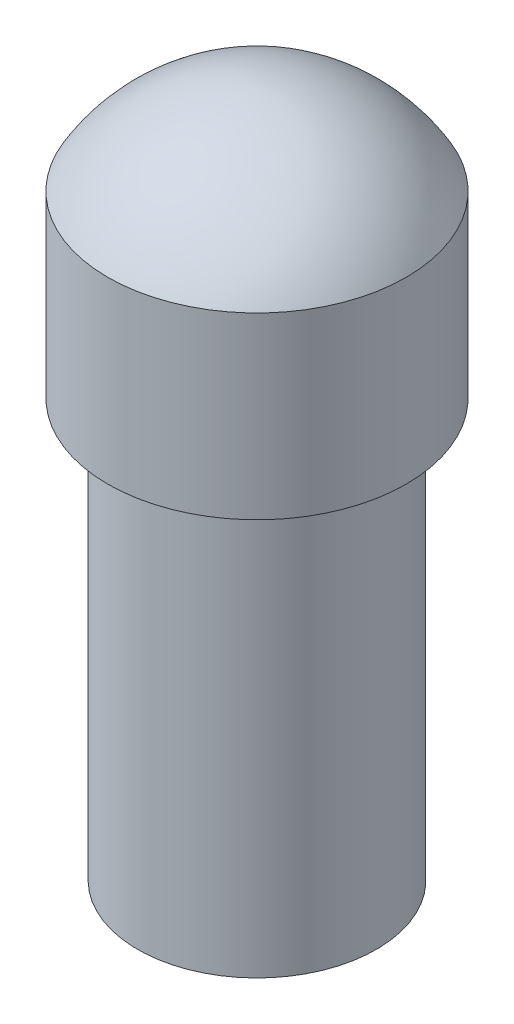
ISO-10303-21;
HEADER;
FILE_DESCRIPTION(('STEP AP214'),'2;1');
FILE_NAME('part.step','',(''),(''),'','','');
FILE_SCHEMA(('AUTOMOTIVE_DESIGN { 1 0 10303 214 1 1 1 1 }'));
ENDSEC;
DATA;
#1=APPLICATION_CONTEXT('core data for automotive mechanical design processes');
#2=APPLICATION_PROTOCOL_DEFINITION('international standard','automotive_design',2000,#1);
#3=PRODUCT_CONTEXT('',#1,'mechanical');
#4=PRODUCT('Part','Part','',(#3));
#5=PRODUCT_RELATED_PRODUCT_CATEGORY('part','',(#4));
#6=PRODUCT_DEFINITION_FORMATION('','',#4);
#7=PRODUCT_DEFINITION_CONTEXT('part definition',#1,'design');
#8=PRODUCT_DEFINITION('design','',#6,#7);
#9=PRODUCT_DEFINITION_SHAPE('','',#8);
#10=(LENGTH_UNIT() NAMED_UNIT(*) SI_UNIT(.MILLI.,.METRE.));
#11=(NAMED_UNIT(*) PLANE_ANGLE_UNIT() SI_UNIT($,.RADIAN.));
#12=(NAMED_UNIT(*) SI_UNIT($,.STERADIAN.) SOLID_ANGLE_UNIT());
#13=UNCERTAINTY_MEASURE_WITH_UNIT(LENGTH_MEASURE(1.E-05),#10,'distance_accuracy_value','');
#14=(GEOMETRIC_REPRESENTATION_CONTEXT(3) GLOBAL_UNCERTAINTY_ASSIGNED_CONTEXT((#13)) GLOBAL_UNIT_ASSIGNED_CONTEXT((#10,
#11,#12)) REPRESENTATION_CONTEXT('',''));
#15=CARTESIAN_POINT('',(0.,0.,0.));
#16=DIRECTION('',(0.,0.,1.));
#17=DIRECTION('',(1.,0.,0.));
#18=AXIS2_PLACEMENT_3D('',#15,#16,#17);
#19=CARTESIAN_POINT('',(0.,0.,0.));
#20=DIRECTION('',(0.,-1.,0.));
#21=DIRECTION('',(0.,0.,-1.));
#22=AXIS2_PLACEMENT_3D('',#19,#20,#21);
#23=PLANE('',#22);
#24=CARTESIAN_POINT('',(0.,0.,0.));
#25=DIRECTION('',(0.,-1.,0.));
#26=DIRECTION('',(0.,0.,-1.));
#27=AXIS2_PLACEMENT_3D('',#24,#25,#26);
#28=CIRCLE('',#27,4.);
#29=CARTESIAN_POINT('',(0.,0.,-4.));
#30=VERTEX_POINT('',#29);
#31=EDGE_CURVE('E61',#30,#30,#28,.T.);
#32=ORIENTED_EDGE('',*,*,#31,.T.);
#33=EDGE_LOOP('',(#32));
#34=FACE_BOUND('',#33,.T.);
#35=ADVANCED_FACE('F37',(#34),#23,.T.);
#36=CARTESIAN_POINT('',(0.,17.0032691613469,0.19803850319188));
#37=DIRECTION('',(-1.,0.,0.));
#38=DIRECTION('',(0.,0.,-1.));
#39=AXIS2_PLACEMENT_3D('',#36,#37,#38);
#40=CIRCLE('',#39,6.);
#41=TRIMMED_CURVE('',#40,(PARAMETER_VALUE(-1.53778391366149)),
(PARAMETER_VALUE(1.53778391366149)),.T.,.PARAMETER.);
#42=CARTESIAN_POINT('',(0.,17.0032691613469,0.));
#43=DIRECTION('',(0.,-1.,0.));
#44=AXIS1_PLACEMENT('',#42,#43);
#45=SURFACE_OF_REVOLUTION('',#41,#44);
#46=CARTESIAN_POINT('',(0.,23.,0.));
#47=VERTEX_POINT('',#46);
#48=VERTEX_LOOP('',#47);
#49=FACE_BOUND('',#48,.T.);
#50=CARTESIAN_POINT('',(0.,20.,0.));
#51=DIRECTION('',(0.,-1.,0.));
#52=DIRECTION('',(0.,0.,-1.));
#53=AXIS2_PLACEMENT_3D('',#50,#51,#52);
#54=CIRCLE('',#53,5.);
#55=CARTESIAN_POINT('',(0.,20.,-5.));
#56=VERTEX_POINT('',#55);
#57=EDGE_CURVE('E11',#56,#56,#54,.T.);
#58=ORIENTED_EDGE('',*,*,#57,.F.);
#59=EDGE_LOOP('',(#58));
#60=FACE_BOUND('',#59,.T.);
#61=ADVANCED_FACE('F46',(#49,#60),#45,.T.);
#62=CARTESIAN_POINT('',(0.,0.,0.));
#63=DIRECTION('',(0.,-1.,0.));
#64=DIRECTION('',(0.,0.,-1.));
#65=AXIS2_PLACEMENT_3D('',#62,#63,#64);
#66=CYLINDRICAL_SURFACE('',#65,5.);
#67=ORIENTED_EDGE('',*,*,#57,.T.);
#68=EDGE_LOOP('',(#67));
#69=FACE_BOUND('',#68,.T.);
#70=CARTESIAN_POINT('',(0.,14.,0.));
#71=DIRECTION('',(0.,-1.,0.));
#72=DIRECTION('',(0.,0.,-1.));
#73=AXIS2_PLACEMENT_3D('',#70,#71,#72);
#74=CIRCLE('',#73,5.);
#75=CARTESIAN_POINT('',(0.,14.,-5.));
#76=VERTEX_POINT('',#75);
#77=EDGE_CURVE('E43',#76,#76,#74,.T.);
#78=ORIENTED_EDGE('',*,*,#77,.F.);
#79=EDGE_LOOP('',(#78));
#80=FACE_BOUND('',#79,.T.);
#81=ADVANCED_FACE('F49',(#69,#80),#66,.T.);
#82=CARTESIAN_POINT('',(5.,14.,0.));
#83=DIRECTION('',(0.,-1.,0.));
#84=DIRECTION('',(0.,0.,-1.));
#85=AXIS2_PLACEMENT_3D('',#82,#83,#84);
#86=PLANE('',#85);
#87=ORIENTED_EDGE('',*,*,#77,.T.);
#88=EDGE_LOOP('',(#87));
#89=FACE_BOUND('',#88,.T.);
#90=CARTESIAN_POINT('',(0.,14.,0.));
#91=DIRECTION('',(0.,-1.,0.));
#92=DIRECTION('',(0.,0.,-1.));
#93=AXIS2_PLACEMENT_3D('',#90,#91,#92);
#94=CIRCLE('',#93,4.);
#95=CARTESIAN_POINT('',(0.,14.,-4.));
#96=VERTEX_POINT('',#95);
#97=EDGE_CURVE('E59',#96,#96,#94,.T.);
#98=ORIENTED_EDGE('',*,*,#97,.F.);
#99=EDGE_LOOP('',(#98));
#100=FACE_BOUND('',#99,.T.);
#101=ADVANCED_FACE('F54',(#89,#100),#86,.T.);
#102=CARTESIAN_POINT('',(0.,0.,0.));
#103=DIRECTION('',(0.,-1.,0.));
#104=DIRECTION('',(0.,0.,-1.));
#105=AXIS2_PLACEMENT_3D('',#102,#103,#104);
#106=CYLINDRICAL_SURFACE('',#105,4.);
#107=ORIENTED_EDGE('',*,*,#97,.T.);
#108=EDGE_LOOP('',(#107));
#109=FACE_BOUND('',#108,.T.);
#110=ORIENTED_EDGE('',*,*,#31,.F.);
#111=EDGE_LOOP('',(#110));
#112=FACE_BOUND('',#111,.T.);
#113=ADVANCED_FACE('F68',(#109,#112),#106,.T.);
#114=CLOSED_SHELL('',(#35,#61,#81,#101,#113));
#115=MANIFOLD_SOLID_BREP('B2',#114);
#116=ADVANCED_BREP_SHAPE_REPRESENTATION('',(#18,#115),#14);
#117=SHAPE_DEFINITION_REPRESENTATION(#9,#116);
ENDSEC;
END-ISO-10303-21;
